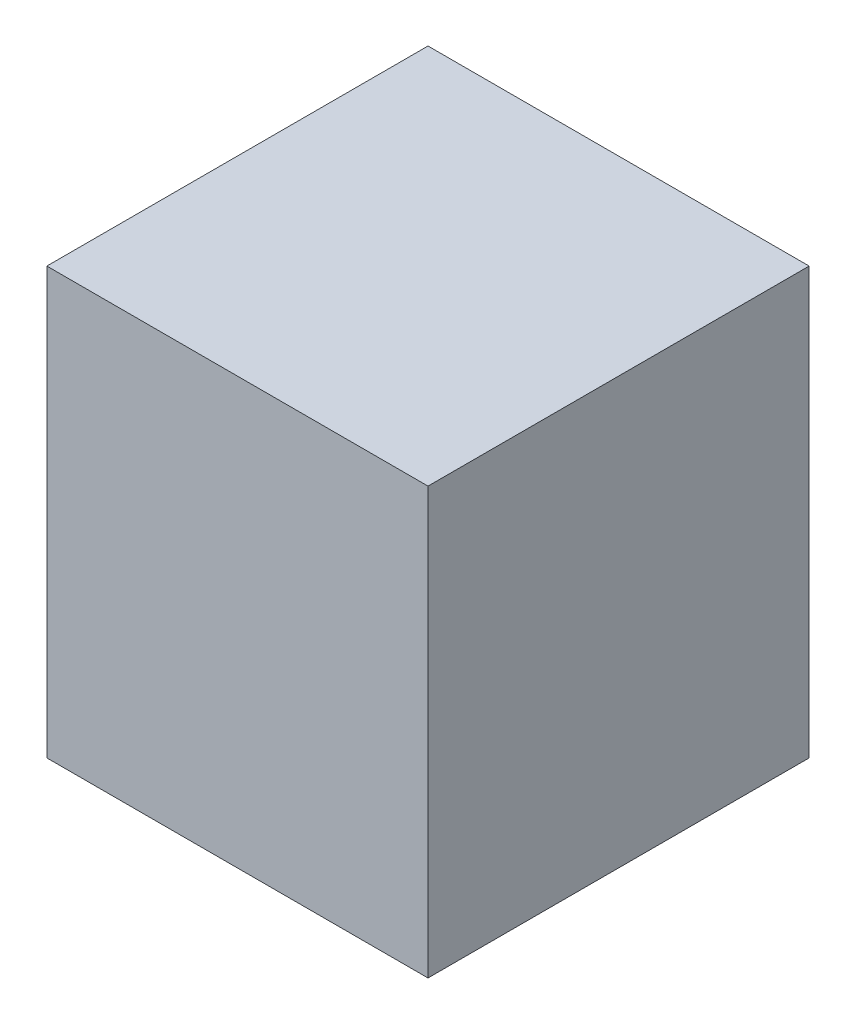
ISO-10303-21;
HEADER;
FILE_DESCRIPTION(('STEP AP214'),'2;1');
FILE_NAME('part.step','',(''),(''),'','','');
FILE_SCHEMA(('AUTOMOTIVE_DESIGN { 1 0 10303 214 1 1 1 1 }'));
ENDSEC;
DATA;
#1=APPLICATION_CONTEXT('core data for automotive mechanical design processes');
#2=APPLICATION_PROTOCOL_DEFINITION('international standard','automotive_design',2000,#1);
#3=PRODUCT_CONTEXT('',#1,'mechanical');
#4=PRODUCT('Part','Part','',(#3));
#5=PRODUCT_RELATED_PRODUCT_CATEGORY('part','',(#4));
#6=PRODUCT_DEFINITION_FORMATION('','',#4);
#7=PRODUCT_DEFINITION_CONTEXT('part definition',#1,'design');
#8=PRODUCT_DEFINITION('design','',#6,#7);
#9=PRODUCT_DEFINITION_SHAPE('','',#8);
#10=(LENGTH_UNIT() NAMED_UNIT(*) SI_UNIT(.MILLI.,.METRE.));
#11=(NAMED_UNIT(*) PLANE_ANGLE_UNIT() SI_UNIT($,.RADIAN.));
#12=(NAMED_UNIT(*) SI_UNIT($,.STERADIAN.) SOLID_ANGLE_UNIT());
#13=UNCERTAINTY_MEASURE_WITH_UNIT(LENGTH_MEASURE(1.E-05),#10,'distance_accuracy_value','');
#14=(GEOMETRIC_REPRESENTATION_CONTEXT(3) GLOBAL_UNCERTAINTY_ASSIGNED_CONTEXT((#13)) GLOBAL_UNIT_ASSIGNED_CONTEXT((#10,
#11,#12)) REPRESENTATION_CONTEXT('',''));
#15=CARTESIAN_POINT('',(0.,0.,0.));
#16=DIRECTION('',(0.,0.,1.));
#17=DIRECTION('',(1.,0.,0.));
#18=AXIS2_PLACEMENT_3D('',#15,#16,#17);
#19=CARTESIAN_POINT('',(-0.86,0.95,-0.01));
#20=CARTESIAN_POINT('',(0.86,0.95,-0.01));
#21=CARTESIAN_POINT('',(-0.86,0.95,1.71));
#22=CARTESIAN_POINT('',(0.86,0.95,1.71));
#23=(BOUNDED_SURFACE() B_SPLINE_SURFACE(1,1,((#19,#20),(#21,#22)),.UNSPECIFIED.,.F.,.F.,
.F.) B_SPLINE_SURFACE_WITH_KNOTS((2,2),(2,2),(-0.086,0.086),(-0.086,0.086),
.UNSPECIFIED.) GEOMETRIC_REPRESENTATION_ITEM() RATIONAL_B_SPLINE_SURFACE(((1.,1.),(1.,1.))) REPRESENTATION_ITEM('') SURFACE());
#24=CARTESIAN_POINT('',(0.85,0.95,1.7));
#25=CARTESIAN_POINT('',(0.85,0.95,0.));
#26=(BOUNDED_CURVE() B_SPLINE_CURVE(1,(#24,#25),.UNSPECIFIED.,.F.,
.F.) B_SPLINE_CURVE_WITH_KNOTS((2,2),(-0.1275,0.0425),
.UNSPECIFIED.) CURVE() GEOMETRIC_REPRESENTATION_ITEM() RATIONAL_B_SPLINE_CURVE((1.,1.)) REPRESENTATION_ITEM(''));
#27=CARTESIAN_POINT('',(0.85,0.95,1.7));
#28=VERTEX_POINT('',#27);
#29=CARTESIAN_POINT('',(0.85,0.95,0.));
#30=VERTEX_POINT('',#29);
#31=EDGE_CURVE('E23',#28,#30,#26,.T.);
#32=CARTESIAN_POINT('',(0.85,0.95,0.));
#33=CARTESIAN_POINT('',(-0.85,0.95,0.));
#34=(BOUNDED_CURVE() B_SPLINE_CURVE(1,(#32,#33),.UNSPECIFIED.,.F.,
.F.) B_SPLINE_CURVE_WITH_KNOTS((2,2),(-0.085,0.085),
.UNSPECIFIED.) CURVE() GEOMETRIC_REPRESENTATION_ITEM() RATIONAL_B_SPLINE_CURVE((1.,1.)) REPRESENTATION_ITEM(''));
#35=CARTESIAN_POINT('',(-0.85,0.95,0.));
#36=VERTEX_POINT('',#35);
#37=EDGE_CURVE('E11',#30,#36,#34,.T.);
#38=CARTESIAN_POINT('',(-0.85,0.95,0.));
#39=CARTESIAN_POINT('',(-0.85,0.95,1.7));
#40=(BOUNDED_CURVE() B_SPLINE_CURVE(1,(#38,#39),.UNSPECIFIED.,.F.,
.F.) B_SPLINE_CURVE_WITH_KNOTS((2,2),(-0.0425,0.1275),
.UNSPECIFIED.) CURVE() GEOMETRIC_REPRESENTATION_ITEM() RATIONAL_B_SPLINE_CURVE((1.,1.)) REPRESENTATION_ITEM(''));
#41=CARTESIAN_POINT('',(-0.85,0.95,1.7));
#42=VERTEX_POINT('',#41);
#43=EDGE_CURVE('E77',#36,#42,#40,.T.);
#44=CARTESIAN_POINT('',(-0.85,0.95,1.7));
#45=CARTESIAN_POINT('',(0.85,0.95,1.7));
#46=(BOUNDED_CURVE() B_SPLINE_CURVE(1,(#44,#45),.UNSPECIFIED.,.F.,
.F.) B_SPLINE_CURVE_WITH_KNOTS((2,2),(-0.085,0.085),
.UNSPECIFIED.) CURVE() GEOMETRIC_REPRESENTATION_ITEM() RATIONAL_B_SPLINE_CURVE((1.,1.)) REPRESENTATION_ITEM(''));
#47=EDGE_CURVE('E131',#42,#28,#46,.T.);
#48=ORIENTED_EDGE('',*,*,#31,.T.);
#49=ORIENTED_EDGE('',*,*,#37,.T.);
#50=ORIENTED_EDGE('',*,*,#43,.T.);
#51=ORIENTED_EDGE('',*,*,#47,.T.);
#52=EDGE_LOOP('',(#48,#49,#50,#51));
#53=FACE_BOUND('',#52,.T.);
#54=ADVANCED_FACE('F17',(#53),#23,.T.);
#55=CARTESIAN_POINT('',(0.86,-0.96,0.));
#56=CARTESIAN_POINT('',(0.86,0.96,0.));
#57=CARTESIAN_POINT('',(-0.86,-0.96,0.));
#58=CARTESIAN_POINT('',(-0.86,0.96,0.));
#59=(BOUNDED_SURFACE() B_SPLINE_SURFACE(1,1,((#55,#56),(#57,#58)),.UNSPECIFIED.,.F.,.F.,
.F.) B_SPLINE_SURFACE_WITH_KNOTS((2,2),(2,2),(-0.086,0.086),(-0.096,0.096),
.UNSPECIFIED.) GEOMETRIC_REPRESENTATION_ITEM() RATIONAL_B_SPLINE_SURFACE(((1.,1.),(1.,1.))) REPRESENTATION_ITEM('') SURFACE());
#60=CARTESIAN_POINT('',(-0.85,-0.95,0.));
#61=CARTESIAN_POINT('',(0.85,-0.95,0.));
#62=(BOUNDED_CURVE() B_SPLINE_CURVE(1,(#60,#61),.UNSPECIFIED.,.F.,
.F.) B_SPLINE_CURVE_WITH_KNOTS((2,2),(-0.085,0.085),
.UNSPECIFIED.) CURVE() GEOMETRIC_REPRESENTATION_ITEM() RATIONAL_B_SPLINE_CURVE((1.,1.)) REPRESENTATION_ITEM(''));
#63=CARTESIAN_POINT('',(-0.85,-0.95,0.));
#64=VERTEX_POINT('',#63);
#65=CARTESIAN_POINT('',(0.85,-0.95,0.));
#66=VERTEX_POINT('',#65);
#67=EDGE_CURVE('E82',#64,#66,#62,.T.);
#68=CARTESIAN_POINT('',(-0.85,-0.95,0.));
#69=CARTESIAN_POINT('',(-0.85,0.95,0.));
#70=(BOUNDED_CURVE() B_SPLINE_CURVE(1,(#68,#69),.UNSPECIFIED.,.F.,
.F.) B_SPLINE_CURVE_WITH_KNOTS((2,2),(0.07,0.26),
.UNSPECIFIED.) CURVE() GEOMETRIC_REPRESENTATION_ITEM() RATIONAL_B_SPLINE_CURVE((1.,1.)) REPRESENTATION_ITEM(''));
#71=EDGE_CURVE('E71',#64,#36,#70,.T.);
#72=CARTESIAN_POINT('',(0.85,0.95,0.));
#73=CARTESIAN_POINT('',(0.85,-0.95,0.));
#74=(BOUNDED_CURVE() B_SPLINE_CURVE(1,(#72,#73),.UNSPECIFIED.,.F.,
.F.) B_SPLINE_CURVE_WITH_KNOTS((2,2),(0.07,0.26),
.UNSPECIFIED.) CURVE() GEOMETRIC_REPRESENTATION_ITEM() RATIONAL_B_SPLINE_CURVE((1.,1.)) REPRESENTATION_ITEM(''));
#75=EDGE_CURVE('E60',#30,#66,#74,.T.);
#76=ORIENTED_EDGE('',*,*,#67,.F.);
#77=ORIENTED_EDGE('',*,*,#71,.T.);
#78=ORIENTED_EDGE('',*,*,#37,.F.);
#79=ORIENTED_EDGE('',*,*,#75,.T.);
#80=EDGE_LOOP('',(#76,#77,#78,#79));
#81=FACE_BOUND('',#80,.T.);
#82=ADVANCED_FACE('F83',(#81),#59,.T.);
#83=CARTESIAN_POINT('',(0.85,-0.96,-0.01));
#84=CARTESIAN_POINT('',(0.85,-0.96,1.71));
#85=CARTESIAN_POINT('',(0.85,0.96,-0.01));
#86=CARTESIAN_POINT('',(0.85,0.96,1.71));
#87=(BOUNDED_SURFACE() B_SPLINE_SURFACE(1,1,((#83,#84),(#85,#86)),.UNSPECIFIED.,.F.,.F.,
.F.) B_SPLINE_SURFACE_WITH_KNOTS((2,2),(2,2),(0.069,0.261),(-0.001,0.171),
.UNSPECIFIED.) GEOMETRIC_REPRESENTATION_ITEM() RATIONAL_B_SPLINE_SURFACE(((1.,1.),(1.,1.))) REPRESENTATION_ITEM('') SURFACE());
#88=CARTESIAN_POINT('',(0.85,-0.95,0.));
#89=CARTESIAN_POINT('',(0.85,-0.95,1.7));
#90=(BOUNDED_CURVE() B_SPLINE_CURVE(1,(#88,#89),.UNSPECIFIED.,.F.,
.F.) B_SPLINE_CURVE_WITH_KNOTS((2,2),(-0.0425,0.1275),
.UNSPECIFIED.) CURVE() GEOMETRIC_REPRESENTATION_ITEM() RATIONAL_B_SPLINE_CURVE((1.,1.)) REPRESENTATION_ITEM(''));
#91=CARTESIAN_POINT('',(0.85,-0.95,1.7));
#92=VERTEX_POINT('',#91);
#93=EDGE_CURVE('E87',#66,#92,#90,.T.);
#94=CARTESIAN_POINT('',(0.85,-0.95,1.7));
#95=CARTESIAN_POINT('',(0.85,0.95,1.7));
#96=(BOUNDED_CURVE() B_SPLINE_CURVE(1,(#94,#95),.UNSPECIFIED.,.F.,
.F.) B_SPLINE_CURVE_WITH_KNOTS((2,2),(-0.26,-0.07),
.UNSPECIFIED.) CURVE() GEOMETRIC_REPRESENTATION_ITEM() RATIONAL_B_SPLINE_CURVE((1.,1.)) REPRESENTATION_ITEM(''));
#97=EDGE_CURVE('E79',#92,#28,#96,.T.);
#98=ORIENTED_EDGE('',*,*,#93,.F.);
#99=ORIENTED_EDGE('',*,*,#75,.F.);
#100=ORIENTED_EDGE('',*,*,#31,.F.);
#101=ORIENTED_EDGE('',*,*,#97,.F.);
#102=EDGE_LOOP('',(#98,#99,#100,#101));
#103=FACE_BOUND('',#102,.T.);
#104=ADVANCED_FACE('F175',(#103),#87,.T.);
#105=CARTESIAN_POINT('',(-0.86,-0.96,1.7));
#106=CARTESIAN_POINT('',(-0.86,0.96,1.7));
#107=CARTESIAN_POINT('',(0.86,-0.96,1.7));
#108=CARTESIAN_POINT('',(0.86,0.96,1.7));
#109=(BOUNDED_SURFACE() B_SPLINE_SURFACE(1,1,((#105,#106),(#107,#108)),.UNSPECIFIED.,.F.,.F.,
.F.) B_SPLINE_SURFACE_WITH_KNOTS((2,2),(2,2),(-0.086,0.086),(-0.096,0.096),
.UNSPECIFIED.) GEOMETRIC_REPRESENTATION_ITEM() RATIONAL_B_SPLINE_SURFACE(((1.,1.),(1.,1.))) REPRESENTATION_ITEM('') SURFACE());
#110=CARTESIAN_POINT('',(0.85,-0.95,1.7));
#111=CARTESIAN_POINT('',(-0.85,-0.95,1.7));
#112=(BOUNDED_CURVE() B_SPLINE_CURVE(1,(#110,#111),.UNSPECIFIED.,.F.,
.F.) B_SPLINE_CURVE_WITH_KNOTS((2,2),(-0.085,0.085),
.UNSPECIFIED.) CURVE() GEOMETRIC_REPRESENTATION_ITEM() RATIONAL_B_SPLINE_CURVE((1.,1.)) REPRESENTATION_ITEM(''));
#113=CARTESIAN_POINT('',(-0.85,-0.95,1.7));
#114=VERTEX_POINT('',#113);
#115=EDGE_CURVE('E91',#92,#114,#112,.T.);
#116=CARTESIAN_POINT('',(-0.85,0.95,1.7));
#117=CARTESIAN_POINT('',(-0.85,-0.95,1.7));
#118=(BOUNDED_CURVE() B_SPLINE_CURVE(1,(#116,#117),.UNSPECIFIED.,.F.,
.F.) B_SPLINE_CURVE_WITH_KNOTS((2,2),(-0.26,-0.07),
.UNSPECIFIED.) CURVE() GEOMETRIC_REPRESENTATION_ITEM() RATIONAL_B_SPLINE_CURVE((1.,1.)) REPRESENTATION_ITEM(''));
#119=EDGE_CURVE('E117',#42,#114,#118,.T.);
#120=ORIENTED_EDGE('',*,*,#115,.F.);
#121=ORIENTED_EDGE('',*,*,#97,.T.);
#122=ORIENTED_EDGE('',*,*,#47,.F.);
#123=ORIENTED_EDGE('',*,*,#119,.T.);
#124=EDGE_LOOP('',(#120,#121,#122,#123));
#125=FACE_BOUND('',#124,.T.);
#126=ADVANCED_FACE('F173',(#125),#109,.T.);
#127=CARTESIAN_POINT('',(-0.85,0.96,-0.01));
#128=CARTESIAN_POINT('',(-0.85,0.96,1.71));
#129=CARTESIAN_POINT('',(-0.85,-0.96,-0.01));
#130=CARTESIAN_POINT('',(-0.85,-0.96,1.71));
#131=(BOUNDED_SURFACE() B_SPLINE_SURFACE(1,1,((#127,#128),(#129,#130)),.UNSPECIFIED.,.F.,.F.,
.F.) B_SPLINE_SURFACE_WITH_KNOTS((2,2),(2,2),(0.069,0.261),(-0.001,0.171),
.UNSPECIFIED.) GEOMETRIC_REPRESENTATION_ITEM() RATIONAL_B_SPLINE_SURFACE(((1.,1.),(1.,1.))) REPRESENTATION_ITEM('') SURFACE());
#132=CARTESIAN_POINT('',(-0.85,-0.95,1.7));
#133=CARTESIAN_POINT('',(-0.85,-0.95,0.));
#134=(BOUNDED_CURVE() B_SPLINE_CURVE(1,(#132,#133),.UNSPECIFIED.,.F.,
.F.) B_SPLINE_CURVE_WITH_KNOTS((2,2),(-0.1275,0.0425),
.UNSPECIFIED.) CURVE() GEOMETRIC_REPRESENTATION_ITEM() RATIONAL_B_SPLINE_CURVE((1.,1.)) REPRESENTATION_ITEM(''));
#135=EDGE_CURVE('E74',#114,#64,#134,.T.);
#136=ORIENTED_EDGE('',*,*,#135,.F.);
#137=ORIENTED_EDGE('',*,*,#119,.F.);
#138=ORIENTED_EDGE('',*,*,#43,.F.);
#139=ORIENTED_EDGE('',*,*,#71,.F.);
#140=EDGE_LOOP('',(#136,#137,#138,#139));
#141=FACE_BOUND('',#140,.T.);
#142=ADVANCED_FACE('F19',(#141),#131,.T.);
#143=CARTESIAN_POINT('',(-0.86,-0.95,1.71));
#144=CARTESIAN_POINT('',(0.86,-0.95,1.71));
#145=CARTESIAN_POINT('',(-0.86,-0.95,-0.01));
#146=CARTESIAN_POINT('',(0.86,-0.95,-0.01));
#147=(BOUNDED_SURFACE() B_SPLINE_SURFACE(1,1,((#143,#144),(#145,#146)),.UNSPECIFIED.,.F.,.F.,
.F.) B_SPLINE_SURFACE_WITH_KNOTS((2,2),(2,2),(-0.086,0.086),(-0.086,0.086),
.UNSPECIFIED.) GEOMETRIC_REPRESENTATION_ITEM() RATIONAL_B_SPLINE_SURFACE(((1.,1.),(1.,1.))) REPRESENTATION_ITEM('') SURFACE());
#148=ORIENTED_EDGE('',*,*,#115,.T.);
#149=ORIENTED_EDGE('',*,*,#135,.T.);
#150=ORIENTED_EDGE('',*,*,#67,.T.);
#151=ORIENTED_EDGE('',*,*,#93,.T.);
#152=EDGE_LOOP('',(#148,#149,#150,#151));
#153=FACE_BOUND('',#152,.T.);
#154=ADVANCED_FACE('F89',(#153),#147,.T.);
#155=CLOSED_SHELL('',(#54,#82,#104,#126,#142,#154));
#156=MANIFOLD_SOLID_BREP('B1',#155);
#157=ADVANCED_BREP_SHAPE_REPRESENTATION('',(#18,#156),#14);
#158=SHAPE_DEFINITION_REPRESENTATION(#9,#157);
ENDSEC;
END-ISO-10303-21;
